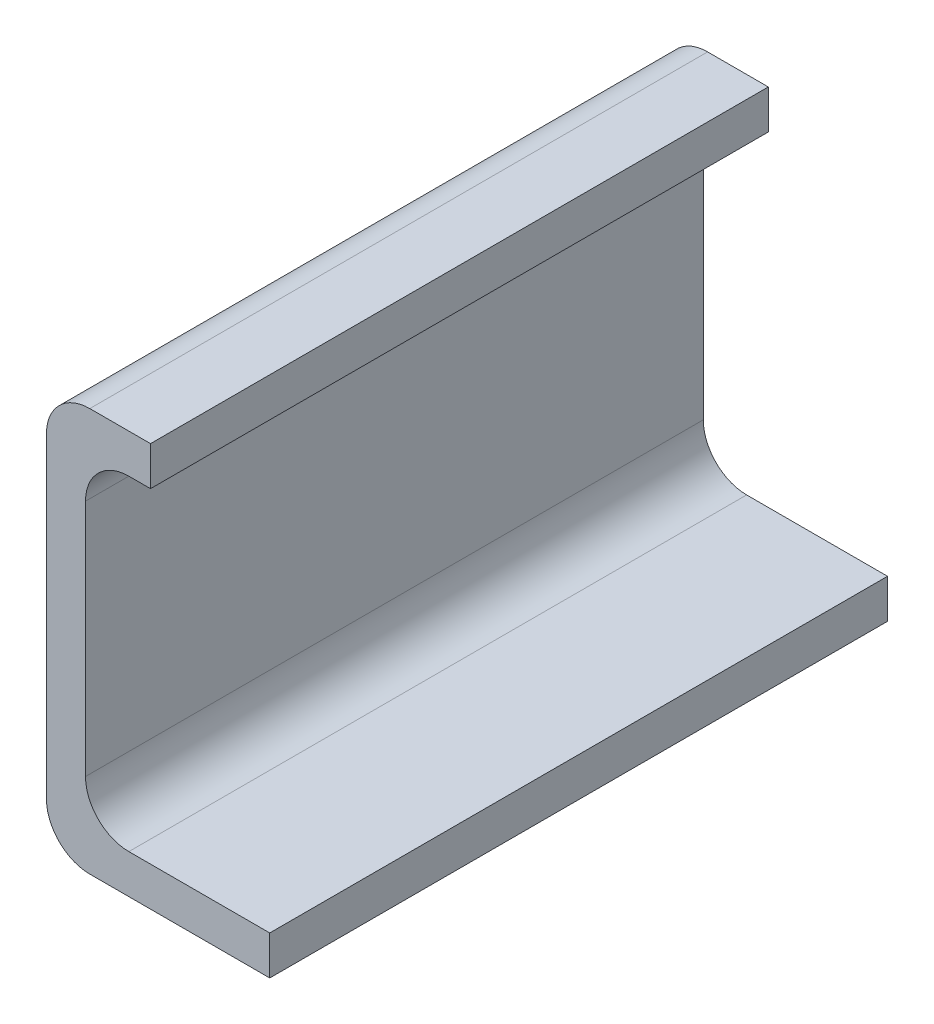
ISO-10303-21;
HEADER;
FILE_DESCRIPTION(('STEP AP214'),'2;1');
FILE_NAME('part.step','',(''),(''),'','','');
FILE_SCHEMA(('AUTOMOTIVE_DESIGN { 1 0 10303 214 1 1 1 1 }'));
ENDSEC;
DATA;
#1=APPLICATION_CONTEXT('core data for automotive mechanical design processes');
#2=APPLICATION_PROTOCOL_DEFINITION('international standard','automotive_design',2000,#1);
#3=PRODUCT_CONTEXT('',#1,'mechanical');
#4=PRODUCT('Part','Part','',(#3));
#5=PRODUCT_RELATED_PRODUCT_CATEGORY('part','',(#4));
#6=PRODUCT_DEFINITION_FORMATION('','',#4);
#7=PRODUCT_DEFINITION_CONTEXT('part definition',#1,'design');
#8=PRODUCT_DEFINITION('design','',#6,#7);
#9=PRODUCT_DEFINITION_SHAPE('','',#8);
#10=(LENGTH_UNIT() NAMED_UNIT(*) SI_UNIT(.MILLI.,.METRE.));
#11=(NAMED_UNIT(*) PLANE_ANGLE_UNIT() SI_UNIT($,.RADIAN.));
#12=(NAMED_UNIT(*) SI_UNIT($,.STERADIAN.) SOLID_ANGLE_UNIT());
#13=UNCERTAINTY_MEASURE_WITH_UNIT(LENGTH_MEASURE(1.E-05),#10,'distance_accuracy_value','');
#14=(GEOMETRIC_REPRESENTATION_CONTEXT(3) GLOBAL_UNCERTAINTY_ASSIGNED_CONTEXT((#13)) GLOBAL_UNIT_ASSIGNED_CONTEXT((#10,
#11,#12)) REPRESENTATION_CONTEXT('',''));
#15=CARTESIAN_POINT('',(0.,0.,0.));
#16=DIRECTION('',(0.,0.,1.));
#17=DIRECTION('',(1.,0.,0.));
#18=AXIS2_PLACEMENT_3D('',#15,#16,#17);
#19=CARTESIAN_POINT('',(0.,0.18,2.85));
#20=DIRECTION('',(1.,0.,0.));
#21=DIRECTION('',(0.,1.,0.));
#22=AXIS2_PLACEMENT_3D('',#19,#20,#21);
#23=PLANE('',#22);
#24=DIRECTION('',(0.,-1.,0.));
#25=VECTOR('',#24,1.);
#26=CARTESIAN_POINT('',(0.,0.18,0.));
#27=LINE('',#26,#25);
#28=CARTESIAN_POINT('',(0.,0.18,0.));
#29=VERTEX_POINT('',#28);
#30=CARTESIAN_POINT('',(0.,0.,0.));
#31=VERTEX_POINT('',#30);
#32=EDGE_CURVE('E11',#29,#31,#27,.T.);
#33=ORIENTED_EDGE('',*,*,#32,.F.);
#34=DIRECTION('',(0.,0.,-1.));
#35=VECTOR('',#34,1.);
#36=CARTESIAN_POINT('',(0.,0.18,2.85));
#37=LINE('',#36,#35);
#38=CARTESIAN_POINT('',(0.,0.18,2.85));
#39=VERTEX_POINT('',#38);
#40=EDGE_CURVE('E23',#39,#29,#37,.T.);
#41=ORIENTED_EDGE('',*,*,#40,.F.);
#42=DIRECTION('',(0.,-1.,0.));
#43=VECTOR('',#42,1.);
#44=CARTESIAN_POINT('',(0.,0.18,2.85));
#45=LINE('',#44,#43);
#46=CARTESIAN_POINT('',(0.,0.,2.85));
#47=VERTEX_POINT('',#46);
#48=EDGE_CURVE('E197',#39,#47,#45,.T.);
#49=ORIENTED_EDGE('',*,*,#48,.T.);
#50=DIRECTION('',(0.,0.,-1.));
#51=VECTOR('',#50,1.);
#52=CARTESIAN_POINT('',(0.,0.,2.85));
#53=LINE('',#52,#51);
#54=EDGE_CURVE('E195',#47,#31,#53,.T.);
#55=ORIENTED_EDGE('',*,*,#54,.T.);
#56=EDGE_LOOP('',(#33,#41,#49,#55));
#57=FACE_BOUND('',#56,.T.);
#58=ADVANCED_FACE('F16',(#57),#23,.T.);
#59=CARTESIAN_POINT('',(0.,0.18,2.85));
#60=DIRECTION('',(0.,-1.,0.));
#61=DIRECTION('',(1.,0.,0.));
#62=AXIS2_PLACEMENT_3D('',#59,#60,#61);
#63=PLANE('',#62);
#64=DIRECTION('',(-1.,0.,0.));
#65=VECTOR('',#64,1.);
#66=CARTESIAN_POINT('',(0.,0.18,0.));
#67=LINE('',#66,#65);
#68=CARTESIAN_POINT('',(-0.28,0.18,0.));
#69=VERTEX_POINT('',#68);
#70=EDGE_CURVE('E193',#29,#69,#67,.T.);
#71=ORIENTED_EDGE('',*,*,#70,.T.);
#72=DIRECTION('',(0.,0.,1.));
#73=VECTOR('',#72,1.);
#74=CARTESIAN_POINT('',(-0.28,0.18,2.85));
#75=LINE('',#74,#73);
#76=CARTESIAN_POINT('',(-0.28,0.18,2.85));
#77=VERTEX_POINT('',#76);
#78=EDGE_CURVE('E191',#69,#77,#75,.T.);
#79=ORIENTED_EDGE('',*,*,#78,.T.);
#80=DIRECTION('',(-1.,0.,0.));
#81=VECTOR('',#80,1.);
#82=CARTESIAN_POINT('',(0.,0.18,2.85));
#83=LINE('',#82,#81);
#84=EDGE_CURVE('E188',#39,#77,#83,.T.);
#85=ORIENTED_EDGE('',*,*,#84,.F.);
#86=ORIENTED_EDGE('',*,*,#40,.T.);
#87=EDGE_LOOP('',(#71,#79,#85,#86));
#88=FACE_BOUND('',#87,.T.);
#89=ADVANCED_FACE('F200',(#88),#63,.F.);
#90=CARTESIAN_POINT('',(-0.48,0.18,2.85));
#91=DIRECTION('',(1.,0.,0.));
#92=DIRECTION('',(0.,1.,0.));
#93=AXIS2_PLACEMENT_3D('',#90,#91,#92);
#94=PLANE('',#93);
#95=DIRECTION('',(0.,-1.,0.));
#96=VECTOR('',#95,1.);
#97=CARTESIAN_POINT('',(-0.48,0.18,0.));
#98=LINE('',#97,#96);
#99=CARTESIAN_POINT('',(-0.48,-0.0200000000000001,0.));
#100=VERTEX_POINT('',#99);
#101=CARTESIAN_POINT('',(-0.48,-1.48,0.));
#102=VERTEX_POINT('',#101);
#103=EDGE_CURVE('E186',#100,#102,#98,.T.);
#104=ORIENTED_EDGE('',*,*,#103,.T.);
#105=DIRECTION('',(0.,0.,1.));
#106=VECTOR('',#105,1.);
#107=CARTESIAN_POINT('',(-0.48,-1.48,2.85));
#108=LINE('',#107,#106);
#109=CARTESIAN_POINT('',(-0.48,-1.48,2.85));
#110=VERTEX_POINT('',#109);
#111=EDGE_CURVE('E184',#102,#110,#108,.T.);
#112=ORIENTED_EDGE('',*,*,#111,.T.);
#113=DIRECTION('',(0.,-1.,0.));
#114=VECTOR('',#113,1.);
#115=CARTESIAN_POINT('',(-0.48,0.18,2.85));
#116=LINE('',#115,#114);
#117=CARTESIAN_POINT('',(-0.48,-0.0200000000000001,2.85));
#118=VERTEX_POINT('',#117);
#119=EDGE_CURVE('E181',#118,#110,#116,.T.);
#120=ORIENTED_EDGE('',*,*,#119,.F.);
#121=DIRECTION('',(0.,0.,-1.));
#122=VECTOR('',#121,1.);
#123=CARTESIAN_POINT('',(-0.48,-0.0200000000000001,2.85));
#124=LINE('',#123,#122);
#125=EDGE_CURVE('E178',#118,#100,#124,.T.);
#126=ORIENTED_EDGE('',*,*,#125,.T.);
#127=EDGE_LOOP('',(#104,#112,#120,#126));
#128=FACE_BOUND('',#127,.T.);
#129=ADVANCED_FACE('F215',(#128),#94,.F.);
#130=CARTESIAN_POINT('',(-0.48,-1.68,2.85));
#131=DIRECTION('',(0.,1.,0.));
#132=DIRECTION('',(-1.,0.,0.));
#133=AXIS2_PLACEMENT_3D('',#130,#131,#132);
#134=PLANE('',#133);
#135=DIRECTION('',(1.,0.,0.));
#136=VECTOR('',#135,1.);
#137=CARTESIAN_POINT('',(-0.48,-1.68,2.85));
#138=LINE('',#137,#136);
#139=CARTESIAN_POINT('',(-0.28,-1.68,2.85));
#140=VERTEX_POINT('',#139);
#141=CARTESIAN_POINT('',(0.55,-1.68,2.85));
#142=VERTEX_POINT('',#141);
#143=EDGE_CURVE('E176',#140,#142,#138,.T.);
#144=ORIENTED_EDGE('',*,*,#143,.F.);
#145=DIRECTION('',(0.,0.,-1.));
#146=VECTOR('',#145,1.);
#147=CARTESIAN_POINT('',(-0.28,-1.68,2.85));
#148=LINE('',#147,#146);
#149=CARTESIAN_POINT('',(-0.28,-1.68,0.));
#150=VERTEX_POINT('',#149);
#151=EDGE_CURVE('E174',#140,#150,#148,.T.);
#152=ORIENTED_EDGE('',*,*,#151,.T.);
#153=DIRECTION('',(1.,0.,0.));
#154=VECTOR('',#153,1.);
#155=CARTESIAN_POINT('',(-0.48,-1.68,0.));
#156=LINE('',#155,#154);
#157=CARTESIAN_POINT('',(0.55,-1.68,0.));
#158=VERTEX_POINT('',#157);
#159=EDGE_CURVE('E172',#150,#158,#156,.T.);
#160=ORIENTED_EDGE('',*,*,#159,.T.);
#161=DIRECTION('',(0.,0.,-1.));
#162=VECTOR('',#161,1.);
#163=CARTESIAN_POINT('',(0.55,-1.68,2.85));
#164=LINE('',#163,#162);
#165=EDGE_CURVE('E169',#142,#158,#164,.T.);
#166=ORIENTED_EDGE('',*,*,#165,.F.);
#167=EDGE_LOOP('',(#144,#152,#160,#166));
#168=FACE_BOUND('',#167,.T.);
#169=ADVANCED_FACE('F219',(#168),#134,.F.);
#170=CARTESIAN_POINT('',(0.55,-1.5,2.85));
#171=DIRECTION('',(1.,0.,0.));
#172=DIRECTION('',(0.,0.,-1.));
#173=AXIS2_PLACEMENT_3D('',#170,#171,#172);
#174=PLANE('',#173);
#175=DIRECTION('',(0.,-1.,0.));
#176=VECTOR('',#175,1.);
#177=CARTESIAN_POINT('',(0.55,-1.5,0.));
#178=LINE('',#177,#176);
#179=CARTESIAN_POINT('',(0.55,-1.5,0.));
#180=VERTEX_POINT('',#179);
#181=EDGE_CURVE('E166',#180,#158,#178,.T.);
#182=ORIENTED_EDGE('',*,*,#181,.F.);
#183=DIRECTION('',(0.,0.,-1.));
#184=VECTOR('',#183,1.);
#185=CARTESIAN_POINT('',(0.55,-1.5,2.85));
#186=LINE('',#185,#184);
#187=CARTESIAN_POINT('',(0.55,-1.5,2.85));
#188=VERTEX_POINT('',#187);
#189=EDGE_CURVE('E163',#188,#180,#186,.T.);
#190=ORIENTED_EDGE('',*,*,#189,.F.);
#191=DIRECTION('',(0.,-1.,0.));
#192=VECTOR('',#191,1.);
#193=CARTESIAN_POINT('',(0.55,-1.5,2.85));
#194=LINE('',#193,#192);
#195=EDGE_CURVE('E160',#188,#142,#194,.T.);
#196=ORIENTED_EDGE('',*,*,#195,.T.);
#197=ORIENTED_EDGE('',*,*,#165,.T.);
#198=EDGE_LOOP('',(#182,#190,#196,#197));
#199=FACE_BOUND('',#198,.T.);
#200=ADVANCED_FACE('F225',(#199),#174,.T.);
#201=CARTESIAN_POINT('',(-0.3,-1.5,2.85));
#202=DIRECTION('',(0.,1.,0.));
#203=DIRECTION('',(-1.,0.,0.));
#204=AXIS2_PLACEMENT_3D('',#201,#202,#203);
#205=PLANE('',#204);
#206=DIRECTION('',(1.,0.,0.));
#207=VECTOR('',#206,1.);
#208=CARTESIAN_POINT('',(-0.3,-1.5,0.));
#209=LINE('',#208,#207);
#210=CARTESIAN_POINT('',(-0.0999999999999999,-1.5,0.));
#211=VERTEX_POINT('',#210);
#212=EDGE_CURVE('E157',#211,#180,#209,.T.);
#213=ORIENTED_EDGE('',*,*,#212,.F.);
#214=DIRECTION('',(0.,0.,1.));
#215=VECTOR('',#214,1.);
#216=CARTESIAN_POINT('',(-0.0999999999999999,-1.5,2.85));
#217=LINE('',#216,#215);
#218=CARTESIAN_POINT('',(-0.0999999999999999,-1.5,2.85));
#219=VERTEX_POINT('',#218);
#220=EDGE_CURVE('E155',#211,#219,#217,.T.);
#221=ORIENTED_EDGE('',*,*,#220,.T.);
#222=DIRECTION('',(1.,0.,0.));
#223=VECTOR('',#222,1.);
#224=CARTESIAN_POINT('',(-0.3,-1.5,2.85));
#225=LINE('',#224,#223);
#226=EDGE_CURVE('E152',#219,#188,#225,.T.);
#227=ORIENTED_EDGE('',*,*,#226,.T.);
#228=ORIENTED_EDGE('',*,*,#189,.T.);
#229=EDGE_LOOP('',(#213,#221,#227,#228));
#230=FACE_BOUND('',#229,.T.);
#231=ADVANCED_FACE('F229',(#230),#205,.T.);
#232=CARTESIAN_POINT('',(-0.3,0.,2.85));
#233=DIRECTION('',(1.,0.,0.));
#234=DIRECTION('',(0.,1.,0.));
#235=AXIS2_PLACEMENT_3D('',#232,#233,#234);
#236=PLANE('',#235);
#237=DIRECTION('',(0.,-1.,0.));
#238=VECTOR('',#237,1.);
#239=CARTESIAN_POINT('',(-0.3,0.,2.85));
#240=LINE('',#239,#238);
#241=CARTESIAN_POINT('',(-0.3,-0.2,2.85));
#242=VERTEX_POINT('',#241);
#243=CARTESIAN_POINT('',(-0.3,-1.3,2.85));
#244=VERTEX_POINT('',#243);
#245=EDGE_CURVE('E150',#242,#244,#240,.T.);
#246=ORIENTED_EDGE('',*,*,#245,.T.);
#247=DIRECTION('',(0.,0.,-1.));
#248=VECTOR('',#247,1.);
#249=CARTESIAN_POINT('',(-0.3,-1.3,0.));
#250=LINE('',#249,#248);
#251=CARTESIAN_POINT('',(-0.3,-1.3,0.));
#252=VERTEX_POINT('',#251);
#253=EDGE_CURVE('E148',#244,#252,#250,.T.);
#254=ORIENTED_EDGE('',*,*,#253,.T.);
#255=DIRECTION('',(0.,-1.,0.));
#256=VECTOR('',#255,1.);
#257=CARTESIAN_POINT('',(-0.3,0.,0.));
#258=LINE('',#257,#256);
#259=CARTESIAN_POINT('',(-0.3,-0.2,0.));
#260=VERTEX_POINT('',#259);
#261=EDGE_CURVE('E146',#260,#252,#258,.T.);
#262=ORIENTED_EDGE('',*,*,#261,.F.);
#263=DIRECTION('',(0.,0.,1.));
#264=VECTOR('',#263,1.);
#265=CARTESIAN_POINT('',(-0.3,-0.2,2.85));
#266=LINE('',#265,#264);
#267=EDGE_CURVE('E122',#260,#242,#266,.T.);
#268=ORIENTED_EDGE('',*,*,#267,.T.);
#269=EDGE_LOOP('',(#246,#254,#262,#268));
#270=FACE_BOUND('',#269,.T.);
#271=ADVANCED_FACE('F233',(#270),#236,.T.);
#272=CARTESIAN_POINT('',(0.,0.,2.85));
#273=DIRECTION('',(0.,-1.,0.));
#274=DIRECTION('',(1.,0.,0.));
#275=AXIS2_PLACEMENT_3D('',#272,#273,#274);
#276=PLANE('',#275);
#277=DIRECTION('',(-1.,0.,0.));
#278=VECTOR('',#277,1.);
#279=CARTESIAN_POINT('',(0.,0.,2.85));
#280=LINE('',#279,#278);
#281=CARTESIAN_POINT('',(-0.0999999999999999,0.,2.85));
#282=VERTEX_POINT('',#281);
#283=EDGE_CURVE('E106',#47,#282,#280,.T.);
#284=ORIENTED_EDGE('',*,*,#283,.T.);
#285=DIRECTION('',(0.,0.,-1.));
#286=VECTOR('',#285,1.);
#287=CARTESIAN_POINT('',(-0.0999999999999999,0.,0.));
#288=LINE('',#287,#286);
#289=CARTESIAN_POINT('',(-0.0999999999999999,0.,0.));
#290=VERTEX_POINT('',#289);
#291=EDGE_CURVE('E101',#282,#290,#288,.T.);
#292=ORIENTED_EDGE('',*,*,#291,.T.);
#293=DIRECTION('',(-1.,0.,0.));
#294=VECTOR('',#293,1.);
#295=CARTESIAN_POINT('',(0.,0.,0.));
#296=LINE('',#295,#294);
#297=EDGE_CURVE('E104',#31,#290,#296,.T.);
#298=ORIENTED_EDGE('',*,*,#297,.F.);
#299=ORIENTED_EDGE('',*,*,#54,.F.);
#300=EDGE_LOOP('',(#284,#292,#298,#299));
#301=FACE_BOUND('',#300,.T.);
#302=ADVANCED_FACE('F102',(#301),#276,.T.);
#303=CARTESIAN_POINT('',(0.,0.,2.85));
#304=DIRECTION('',(0.,0.,-1.));
#305=DIRECTION('',(-1.,0.,0.));
#306=AXIS2_PLACEMENT_3D('',#303,#304,#305);
#307=PLANE('',#306);
#308=ORIENTED_EDGE('',*,*,#119,.T.);
#309=CARTESIAN_POINT('',(-0.28,-1.48,2.85));
#310=DIRECTION('',(0.,0.,1.));
#311=DIRECTION('',(-1.,0.,0.));
#312=AXIS2_PLACEMENT_3D('',#309,#310,#311);
#313=CIRCLE('',#312,0.2);
#314=EDGE_CURVE('E117',#110,#140,#313,.T.);
#315=ORIENTED_EDGE('',*,*,#314,.T.);
#316=ORIENTED_EDGE('',*,*,#143,.T.);
#317=ORIENTED_EDGE('',*,*,#195,.F.);
#318=ORIENTED_EDGE('',*,*,#226,.F.);
#319=CARTESIAN_POINT('',(-0.0999999999999998,-1.3,2.85));
#320=DIRECTION('',(0.,0.,-1.));
#321=DIRECTION('',(-1.,0.,0.));
#322=AXIS2_PLACEMENT_3D('',#319,#320,#321);
#323=CIRCLE('',#322,0.2);
#324=EDGE_CURVE('E139',#219,#244,#323,.T.);
#325=ORIENTED_EDGE('',*,*,#324,.T.);
#326=ORIENTED_EDGE('',*,*,#245,.F.);
#327=CARTESIAN_POINT('',(-0.0999999999999999,-0.2,2.85));
#328=DIRECTION('',(0.,0.,-1.));
#329=DIRECTION('',(-1.,0.,0.));
#330=AXIS2_PLACEMENT_3D('',#327,#328,#329);
#331=CIRCLE('',#330,0.2);
#332=EDGE_CURVE('E137',#242,#282,#331,.T.);
#333=ORIENTED_EDGE('',*,*,#332,.T.);
#334=ORIENTED_EDGE('',*,*,#283,.F.);
#335=ORIENTED_EDGE('',*,*,#48,.F.);
#336=ORIENTED_EDGE('',*,*,#84,.T.);
#337=CARTESIAN_POINT('',(-0.28,-0.02,2.85));
#338=DIRECTION('',(0.,0.,1.));
#339=DIRECTION('',(-1.,0.,0.));
#340=AXIS2_PLACEMENT_3D('',#337,#338,#339);
#341=CIRCLE('',#340,0.2);
#342=EDGE_CURVE('E134',#77,#118,#341,.T.);
#343=ORIENTED_EDGE('',*,*,#342,.T.);
#344=EDGE_LOOP('',(#308,#315,#316,#317,#318,#325,#326,#333,#334,#335,#336,#343));
#345=FACE_BOUND('',#344,.T.);
#346=ADVANCED_FACE('F209',(#345),#307,.F.);
#347=CARTESIAN_POINT('',(0.,0.,0.));
#348=DIRECTION('',(0.,0.,-1.));
#349=DIRECTION('',(-1.,0.,0.));
#350=AXIS2_PLACEMENT_3D('',#347,#348,#349);
#351=PLANE('',#350);
#352=ORIENTED_EDGE('',*,*,#159,.F.);
#353=CARTESIAN_POINT('',(-0.28,-1.48,0.));
#354=DIRECTION('',(0.,0.,-1.));
#355=DIRECTION('',(-1.,0.,0.));
#356=AXIS2_PLACEMENT_3D('',#353,#354,#355);
#357=CIRCLE('',#356,0.2);
#358=EDGE_CURVE('E127',#150,#102,#357,.T.);
#359=ORIENTED_EDGE('',*,*,#358,.T.);
#360=ORIENTED_EDGE('',*,*,#103,.F.);
#361=CARTESIAN_POINT('',(-0.28,-0.02,0.));
#362=DIRECTION('',(0.,0.,-1.));
#363=DIRECTION('',(-1.,0.,0.));
#364=AXIS2_PLACEMENT_3D('',#361,#362,#363);
#365=CIRCLE('',#364,0.2);
#366=EDGE_CURVE('E123',#100,#69,#365,.T.);
#367=ORIENTED_EDGE('',*,*,#366,.T.);
#368=ORIENTED_EDGE('',*,*,#70,.F.);
#369=ORIENTED_EDGE('',*,*,#32,.T.);
#370=ORIENTED_EDGE('',*,*,#297,.T.);
#371=CARTESIAN_POINT('',(-0.0999999999999999,-0.2,0.));
#372=DIRECTION('',(0.,0.,1.));
#373=DIRECTION('',(-1.,0.,0.));
#374=AXIS2_PLACEMENT_3D('',#371,#372,#373);
#375=CIRCLE('',#374,0.2);
#376=EDGE_CURVE('E116',#290,#260,#375,.T.);
#377=ORIENTED_EDGE('',*,*,#376,.T.);
#378=ORIENTED_EDGE('',*,*,#261,.T.);
#379=CARTESIAN_POINT('',(-0.0999999999999998,-1.3,0.));
#380=DIRECTION('',(0.,0.,1.));
#381=DIRECTION('',(-1.,0.,0.));
#382=AXIS2_PLACEMENT_3D('',#379,#380,#381);
#383=CIRCLE('',#382,0.2);
#384=EDGE_CURVE('E124',#252,#211,#383,.T.);
#385=ORIENTED_EDGE('',*,*,#384,.T.);
#386=ORIENTED_EDGE('',*,*,#212,.T.);
#387=ORIENTED_EDGE('',*,*,#181,.T.);
#388=EDGE_LOOP('',(#352,#359,#360,#367,#368,#369,#370,#377,#378,#385,#386,#387));
#389=FACE_BOUND('',#388,.T.);
#390=ADVANCED_FACE('F114',(#389),#351,.T.);
#391=CARTESIAN_POINT('',(-0.28,-1.48,2.85));
#392=DIRECTION('',(0.,0.,-1.));
#393=DIRECTION('',(-1.,0.,0.));
#394=AXIS2_PLACEMENT_3D('',#391,#392,#393);
#395=CYLINDRICAL_SURFACE('',#394,0.2);
#396=ORIENTED_EDGE('',*,*,#314,.F.);
#397=ORIENTED_EDGE('',*,*,#111,.F.);
#398=ORIENTED_EDGE('',*,*,#358,.F.);
#399=ORIENTED_EDGE('',*,*,#151,.F.);
#400=EDGE_LOOP('',(#396,#397,#398,#399));
#401=FACE_BOUND('',#400,.T.);
#402=ADVANCED_FACE('F244',(#401),#395,.T.);
#403=CARTESIAN_POINT('',(-0.0999999999999998,-1.3,2.85));
#404=DIRECTION('',(0.,0.,1.));
#405=DIRECTION('',(1.,0.,0.));
#406=AXIS2_PLACEMENT_3D('',#403,#404,#405);
#407=CYLINDRICAL_SURFACE('',#406,0.2);
#408=ORIENTED_EDGE('',*,*,#324,.F.);
#409=ORIENTED_EDGE('',*,*,#220,.F.);
#410=ORIENTED_EDGE('',*,*,#384,.F.);
#411=ORIENTED_EDGE('',*,*,#253,.F.);
#412=EDGE_LOOP('',(#408,#409,#410,#411));
#413=FACE_BOUND('',#412,.T.);
#414=ADVANCED_FACE('F247',(#413),#407,.F.);
#415=CARTESIAN_POINT('',(-0.0999999999999999,-0.2,2.85));
#416=DIRECTION('',(0.,0.,1.));
#417=DIRECTION('',(1.,0.,0.));
#418=AXIS2_PLACEMENT_3D('',#415,#416,#417);
#419=CYLINDRICAL_SURFACE('',#418,0.2);
#420=ORIENTED_EDGE('',*,*,#332,.F.);
#421=ORIENTED_EDGE('',*,*,#267,.F.);
#422=ORIENTED_EDGE('',*,*,#376,.F.);
#423=ORIENTED_EDGE('',*,*,#291,.F.);
#424=EDGE_LOOP('',(#420,#421,#422,#423));
#425=FACE_BOUND('',#424,.T.);
#426=ADVANCED_FACE('F120',(#425),#419,.F.);
#427=CARTESIAN_POINT('',(-0.28,-0.02,2.85));
#428=DIRECTION('',(0.,0.,-1.));
#429=DIRECTION('',(-1.,0.,0.));
#430=AXIS2_PLACEMENT_3D('',#427,#428,#429);
#431=CYLINDRICAL_SURFACE('',#430,0.2);
#432=ORIENTED_EDGE('',*,*,#342,.F.);
#433=ORIENTED_EDGE('',*,*,#78,.F.);
#434=ORIENTED_EDGE('',*,*,#366,.F.);
#435=ORIENTED_EDGE('',*,*,#125,.F.);
#436=EDGE_LOOP('',(#432,#433,#434,#435));
#437=FACE_BOUND('',#436,.T.);
#438=ADVANCED_FACE('F207',(#437),#431,.T.);
#439=CLOSED_SHELL('',(#58,#89,#129,#169,#200,#231,#271,#302,#346,#390,#402,#414,#426,#438));
#440=MANIFOLD_SOLID_BREP('B1',#439);
#441=ADVANCED_BREP_SHAPE_REPRESENTATION('',(#18,#440),#14);
#442=SHAPE_DEFINITION_REPRESENTATION(#9,#441);
ENDSEC;
END-ISO-10303-21;
